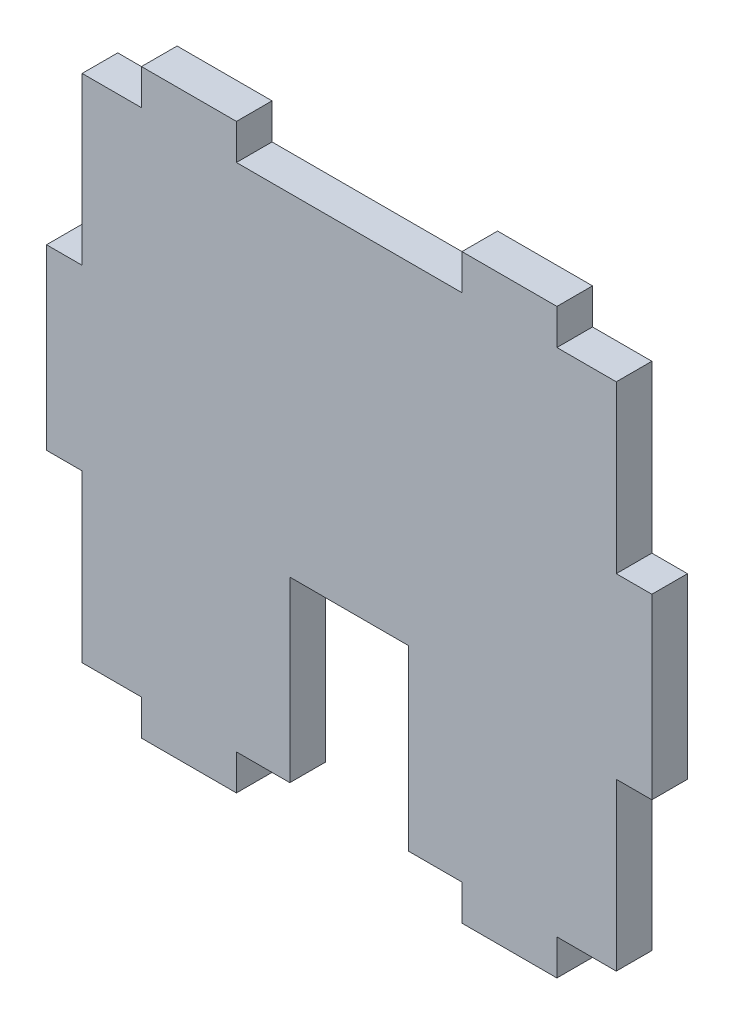
ISO-10303-21;
HEADER;
FILE_DESCRIPTION(('STEP AP214'),'2;1');
FILE_NAME('part.step','',(''),(''),'','','');
FILE_SCHEMA(('AUTOMOTIVE_DESIGN { 1 0 10303 214 1 1 1 1 }'));
ENDSEC;
DATA;
#1=APPLICATION_CONTEXT('core data for automotive mechanical design processes');
#2=APPLICATION_PROTOCOL_DEFINITION('international standard','automotive_design',2000,#1);
#3=PRODUCT_CONTEXT('',#1,'mechanical');
#4=PRODUCT('Part','Part','',(#3));
#5=PRODUCT_RELATED_PRODUCT_CATEGORY('part','',(#4));
#6=PRODUCT_DEFINITION_FORMATION('','',#4);
#7=PRODUCT_DEFINITION_CONTEXT('part definition',#1,'design');
#8=PRODUCT_DEFINITION('design','',#6,#7);
#9=PRODUCT_DEFINITION_SHAPE('','',#8);
#10=(LENGTH_UNIT() NAMED_UNIT(*) SI_UNIT(.MILLI.,.METRE.));
#11=(NAMED_UNIT(*) PLANE_ANGLE_UNIT() SI_UNIT($,.RADIAN.));
#12=(NAMED_UNIT(*) SI_UNIT($,.STERADIAN.) SOLID_ANGLE_UNIT());
#13=UNCERTAINTY_MEASURE_WITH_UNIT(LENGTH_MEASURE(1.E-05),#10,'distance_accuracy_value','');
#14=(GEOMETRIC_REPRESENTATION_CONTEXT(3) GLOBAL_UNCERTAINTY_ASSIGNED_CONTEXT((#13)) GLOBAL_UNIT_ASSIGNED_CONTEXT((#10,
#11,#12)) REPRESENTATION_CONTEXT('',''));
#15=CARTESIAN_POINT('',(0.,0.,0.));
#16=DIRECTION('',(0.,0.,1.));
#17=DIRECTION('',(1.,0.,0.));
#18=AXIS2_PLACEMENT_3D('',#15,#16,#17);
#19=CARTESIAN_POINT('',(0.,-21.5,3.));
#20=DIRECTION('',(0.,1.,0.));
#21=DIRECTION('',(0.,0.,1.));
#22=AXIS2_PLACEMENT_3D('',#19,#20,#21);
#23=PLANE('',#22);
#24=DIRECTION('',(1.,0.,0.));
#25=VECTOR('',#24,1.);
#26=CARTESIAN_POINT('',(0.,-21.5,3.));
#27=LINE('',#26,#25);
#28=CARTESIAN_POINT('',(5.,-21.5,3.));
#29=VERTEX_POINT('',#28);
#30=CARTESIAN_POINT('',(9.5,-21.5,3.));
#31=VERTEX_POINT('',#30);
#32=EDGE_CURVE('E428',#29,#31,#27,.T.);
#33=ORIENTED_EDGE('',*,*,#32,.F.);
#34=DIRECTION('',(0.,0.,1.));
#35=VECTOR('',#34,1.);
#36=CARTESIAN_POINT('',(5.,-21.5,-7.));
#37=LINE('',#36,#35);
#38=CARTESIAN_POINT('',(5.,-21.5,0.));
#39=VERTEX_POINT('',#38);
#40=EDGE_CURVE('E272',#39,#29,#37,.T.);
#41=ORIENTED_EDGE('',*,*,#40,.F.);
#42=DIRECTION('',(1.,0.,0.));
#43=VECTOR('',#42,1.);
#44=CARTESIAN_POINT('',(0.,-21.5,0.));
#45=LINE('',#44,#43);
#46=CARTESIAN_POINT('',(9.5,-21.5,0.));
#47=VERTEX_POINT('',#46);
#48=EDGE_CURVE('E309',#39,#47,#45,.T.);
#49=ORIENTED_EDGE('',*,*,#48,.T.);
#50=DIRECTION('',(0.,0.,-1.));
#51=VECTOR('',#50,1.);
#52=CARTESIAN_POINT('',(9.5,-21.5,3.));
#53=LINE('',#52,#51);
#54=EDGE_CURVE('E346',#31,#47,#53,.T.);
#55=ORIENTED_EDGE('',*,*,#54,.F.);
#56=EDGE_LOOP('',(#33,#41,#49,#55));
#57=FACE_BOUND('',#56,.T.);
#58=ADVANCED_FACE('F41',(#57),#23,.F.);
#59=CARTESIAN_POINT('',(22.5,0.,3.));
#60=DIRECTION('',(1.,0.,0.));
#61=DIRECTION('',(0.,1.,0.));
#62=AXIS2_PLACEMENT_3D('',#59,#60,#61);
#63=PLANE('',#62);
#64=DIRECTION('',(0.,-1.,0.));
#65=VECTOR('',#64,1.);
#66=CARTESIAN_POINT('',(22.5,0.,0.));
#67=LINE('',#66,#65);
#68=CARTESIAN_POINT('',(22.5,21.5,0.));
#69=VERTEX_POINT('',#68);
#70=CARTESIAN_POINT('',(22.5,7.5,0.));
#71=VERTEX_POINT('',#70);
#72=EDGE_CURVE('E269',#69,#71,#67,.T.);
#73=ORIENTED_EDGE('',*,*,#72,.F.);
#74=DIRECTION('',(0.,0.,-1.));
#75=VECTOR('',#74,1.);
#76=CARTESIAN_POINT('',(22.5,21.5,3.));
#77=LINE('',#76,#75);
#78=CARTESIAN_POINT('',(22.5,21.5,3.));
#79=VERTEX_POINT('',#78);
#80=EDGE_CURVE('E161',#79,#69,#77,.T.);
#81=ORIENTED_EDGE('',*,*,#80,.F.);
#82=DIRECTION('',(0.,-1.,0.));
#83=VECTOR('',#82,1.);
#84=CARTESIAN_POINT('',(22.5,0.,3.));
#85=LINE('',#84,#83);
#86=CARTESIAN_POINT('',(22.5,7.5,3.));
#87=VERTEX_POINT('',#86);
#88=EDGE_CURVE('E334',#79,#87,#85,.T.);
#89=ORIENTED_EDGE('',*,*,#88,.T.);
#90=DIRECTION('',(0.,0.,-1.));
#91=VECTOR('',#90,1.);
#92=CARTESIAN_POINT('',(22.5,7.5,3.));
#93=LINE('',#92,#91);
#94=EDGE_CURVE('E65',#87,#71,#93,.T.);
#95=ORIENTED_EDGE('',*,*,#94,.T.);
#96=EDGE_LOOP('',(#73,#81,#89,#95));
#97=FACE_BOUND('',#96,.T.);
#98=ADVANCED_FACE('F518',(#97),#63,.T.);
#99=CARTESIAN_POINT('',(0.,21.5,3.));
#100=DIRECTION('',(0.,1.,0.));
#101=DIRECTION('',(0.,0.,1.));
#102=AXIS2_PLACEMENT_3D('',#99,#100,#101);
#103=PLANE('',#102);
#104=DIRECTION('',(1.,0.,0.));
#105=VECTOR('',#104,1.);
#106=CARTESIAN_POINT('',(0.,21.5,0.));
#107=LINE('',#106,#105);
#108=CARTESIAN_POINT('',(17.5,21.5,0.));
#109=VERTEX_POINT('',#108);
#110=EDGE_CURVE('E271',#109,#69,#107,.T.);
#111=ORIENTED_EDGE('',*,*,#110,.F.);
#112=DIRECTION('',(0.,0.,-1.));
#113=VECTOR('',#112,1.);
#114=CARTESIAN_POINT('',(17.5,21.5,3.));
#115=LINE('',#114,#113);
#116=CARTESIAN_POINT('',(17.5,21.5,3.));
#117=VERTEX_POINT('',#116);
#118=EDGE_CURVE('E389',#117,#109,#115,.T.);
#119=ORIENTED_EDGE('',*,*,#118,.F.);
#120=DIRECTION('',(1.,0.,0.));
#121=VECTOR('',#120,1.);
#122=CARTESIAN_POINT('',(0.,21.5,3.));
#123=LINE('',#122,#121);
#124=EDGE_CURVE('E473',#117,#79,#123,.T.);
#125=ORIENTED_EDGE('',*,*,#124,.T.);
#126=ORIENTED_EDGE('',*,*,#80,.T.);
#127=EDGE_LOOP('',(#111,#119,#125,#126));
#128=FACE_BOUND('',#127,.T.);
#129=ADVANCED_FACE('F525',(#128),#103,.T.);
#130=CARTESIAN_POINT('',(17.5,0.,3.));
#131=DIRECTION('',(-1.,0.,0.));
#132=DIRECTION('',(0.,-1.,0.));
#133=AXIS2_PLACEMENT_3D('',#130,#131,#132);
#134=PLANE('',#133);
#135=DIRECTION('',(0.,1.,0.));
#136=VECTOR('',#135,1.);
#137=CARTESIAN_POINT('',(17.5,0.,0.));
#138=LINE('',#137,#136);
#139=CARTESIAN_POINT('',(17.5,24.5,0.));
#140=VERTEX_POINT('',#139);
#141=EDGE_CURVE('E276',#109,#140,#138,.T.);
#142=ORIENTED_EDGE('',*,*,#141,.T.);
#143=DIRECTION('',(0.,0.,-1.));
#144=VECTOR('',#143,1.);
#145=CARTESIAN_POINT('',(17.5,24.5,3.));
#146=LINE('',#145,#144);
#147=CARTESIAN_POINT('',(17.5,24.5,3.));
#148=VERTEX_POINT('',#147);
#149=EDGE_CURVE('E386',#148,#140,#146,.T.);
#150=ORIENTED_EDGE('',*,*,#149,.F.);
#151=DIRECTION('',(0.,1.,0.));
#152=VECTOR('',#151,1.);
#153=CARTESIAN_POINT('',(17.5,0.,3.));
#154=LINE('',#153,#152);
#155=EDGE_CURVE('E471',#117,#148,#154,.T.);
#156=ORIENTED_EDGE('',*,*,#155,.F.);
#157=ORIENTED_EDGE('',*,*,#118,.T.);
#158=EDGE_LOOP('',(#142,#150,#156,#157));
#159=FACE_BOUND('',#158,.T.);
#160=ADVANCED_FACE('F43',(#159),#134,.F.);
#161=CARTESIAN_POINT('',(0.,24.5,3.));
#162=DIRECTION('',(0.,-1.,0.));
#163=DIRECTION('',(1.,0.,0.));
#164=AXIS2_PLACEMENT_3D('',#161,#162,#163);
#165=PLANE('',#164);
#166=DIRECTION('',(-1.,0.,0.));
#167=VECTOR('',#166,1.);
#168=CARTESIAN_POINT('',(0.,24.5,0.));
#169=LINE('',#168,#167);
#170=CARTESIAN_POINT('',(9.5,24.5,0.));
#171=VERTEX_POINT('',#170);
#172=EDGE_CURVE('E280',#140,#171,#169,.T.);
#173=ORIENTED_EDGE('',*,*,#172,.T.);
#174=DIRECTION('',(0.,0.,-1.));
#175=VECTOR('',#174,1.);
#176=CARTESIAN_POINT('',(9.5,24.5,3.));
#177=LINE('',#176,#175);
#178=CARTESIAN_POINT('',(9.5,24.5,3.));
#179=VERTEX_POINT('',#178);
#180=EDGE_CURVE('E384',#179,#171,#177,.T.);
#181=ORIENTED_EDGE('',*,*,#180,.F.);
#182=DIRECTION('',(-1.,0.,0.));
#183=VECTOR('',#182,1.);
#184=CARTESIAN_POINT('',(0.,24.5,3.));
#185=LINE('',#184,#183);
#186=EDGE_CURVE('E469',#148,#179,#185,.T.);
#187=ORIENTED_EDGE('',*,*,#186,.F.);
#188=ORIENTED_EDGE('',*,*,#149,.T.);
#189=EDGE_LOOP('',(#173,#181,#187,#188));
#190=FACE_BOUND('',#189,.T.);
#191=ADVANCED_FACE('F596',(#190),#165,.F.);
#192=CARTESIAN_POINT('',(9.5,0.,3.));
#193=DIRECTION('',(-1.,0.,0.));
#194=DIRECTION('',(0.,0.,1.));
#195=AXIS2_PLACEMENT_3D('',#192,#193,#194);
#196=PLANE('',#195);
#197=DIRECTION('',(0.,1.,0.));
#198=VECTOR('',#197,1.);
#199=CARTESIAN_POINT('',(9.5,0.,0.));
#200=LINE('',#199,#198);
#201=CARTESIAN_POINT('',(9.5,21.5,0.));
#202=VERTEX_POINT('',#201);
#203=EDGE_CURVE('E283',#202,#171,#200,.T.);
#204=ORIENTED_EDGE('',*,*,#203,.F.);
#205=DIRECTION('',(0.,0.,-1.));
#206=VECTOR('',#205,1.);
#207=CARTESIAN_POINT('',(9.5,21.5,3.));
#208=LINE('',#207,#206);
#209=CARTESIAN_POINT('',(9.5,21.5,3.));
#210=VERTEX_POINT('',#209);
#211=EDGE_CURVE('E382',#210,#202,#208,.T.);
#212=ORIENTED_EDGE('',*,*,#211,.F.);
#213=DIRECTION('',(0.,1.,0.));
#214=VECTOR('',#213,1.);
#215=CARTESIAN_POINT('',(9.5,0.,3.));
#216=LINE('',#215,#214);
#217=EDGE_CURVE('E466',#210,#179,#216,.T.);
#218=ORIENTED_EDGE('',*,*,#217,.T.);
#219=ORIENTED_EDGE('',*,*,#180,.T.);
#220=EDGE_LOOP('',(#204,#212,#218,#219));
#221=FACE_BOUND('',#220,.T.);
#222=ADVANCED_FACE('F594',(#221),#196,.T.);
#223=CARTESIAN_POINT('',(-9.5,21.5,0.));
#224=VERTEX_POINT('',#223);
#225=EDGE_CURVE('E278',#224,#202,#107,.T.);
#226=ORIENTED_EDGE('',*,*,#225,.F.);
#227=DIRECTION('',(0.,0.,-1.));
#228=VECTOR('',#227,1.);
#229=CARTESIAN_POINT('',(-9.5,21.5,3.));
#230=LINE('',#229,#228);
#231=CARTESIAN_POINT('',(-9.5,21.5,3.));
#232=VERTEX_POINT('',#231);
#233=EDGE_CURVE('E380',#232,#224,#230,.T.);
#234=ORIENTED_EDGE('',*,*,#233,.F.);
#235=EDGE_CURVE('E465',#232,#210,#123,.T.);
#236=ORIENTED_EDGE('',*,*,#235,.T.);
#237=ORIENTED_EDGE('',*,*,#211,.T.);
#238=EDGE_LOOP('',(#226,#234,#236,#237));
#239=FACE_BOUND('',#238,.T.);
#240=ADVANCED_FACE('F582',(#239),#103,.T.);
#241=CARTESIAN_POINT('',(-9.5,0.,3.));
#242=DIRECTION('',(-1.,0.,0.));
#243=DIRECTION('',(0.,0.,1.));
#244=AXIS2_PLACEMENT_3D('',#241,#242,#243);
#245=PLANE('',#244);
#246=DIRECTION('',(0.,1.,0.));
#247=VECTOR('',#246,1.);
#248=CARTESIAN_POINT('',(-9.5,0.,0.));
#249=LINE('',#248,#247);
#250=CARTESIAN_POINT('',(-9.5,24.5,0.));
#251=VERTEX_POINT('',#250);
#252=EDGE_CURVE('E286',#224,#251,#249,.T.);
#253=ORIENTED_EDGE('',*,*,#252,.T.);
#254=DIRECTION('',(0.,0.,-1.));
#255=VECTOR('',#254,1.);
#256=CARTESIAN_POINT('',(-9.5,24.5,3.));
#257=LINE('',#256,#255);
#258=CARTESIAN_POINT('',(-9.5,24.5,3.));
#259=VERTEX_POINT('',#258);
#260=EDGE_CURVE('E378',#259,#251,#257,.T.);
#261=ORIENTED_EDGE('',*,*,#260,.F.);
#262=DIRECTION('',(0.,1.,0.));
#263=VECTOR('',#262,1.);
#264=CARTESIAN_POINT('',(-9.5,0.,3.));
#265=LINE('',#264,#263);
#266=EDGE_CURVE('E463',#232,#259,#265,.T.);
#267=ORIENTED_EDGE('',*,*,#266,.F.);
#268=ORIENTED_EDGE('',*,*,#233,.T.);
#269=EDGE_LOOP('',(#253,#261,#267,#268));
#270=FACE_BOUND('',#269,.T.);
#271=ADVANCED_FACE('F589',(#270),#245,.F.);
#272=CARTESIAN_POINT('',(0.,24.5,3.));
#273=DIRECTION('',(0.,1.,0.));
#274=DIRECTION('',(-1.,0.,0.));
#275=AXIS2_PLACEMENT_3D('',#272,#273,#274);
#276=PLANE('',#275);
#277=DIRECTION('',(1.,0.,0.));
#278=VECTOR('',#277,1.);
#279=CARTESIAN_POINT('',(0.,24.5,0.));
#280=LINE('',#279,#278);
#281=CARTESIAN_POINT('',(-17.5,24.5,0.));
#282=VERTEX_POINT('',#281);
#283=EDGE_CURVE('E289',#282,#251,#280,.T.);
#284=ORIENTED_EDGE('',*,*,#283,.F.);
#285=DIRECTION('',(0.,0.,-1.));
#286=VECTOR('',#285,1.);
#287=CARTESIAN_POINT('',(-17.5,24.5,3.));
#288=LINE('',#287,#286);
#289=CARTESIAN_POINT('',(-17.5,24.5,3.));
#290=VERTEX_POINT('',#289);
#291=EDGE_CURVE('E376',#290,#282,#288,.T.);
#292=ORIENTED_EDGE('',*,*,#291,.F.);
#293=DIRECTION('',(1.,0.,0.));
#294=VECTOR('',#293,1.);
#295=CARTESIAN_POINT('',(0.,24.5,3.));
#296=LINE('',#295,#294);
#297=EDGE_CURVE('E460',#290,#259,#296,.T.);
#298=ORIENTED_EDGE('',*,*,#297,.T.);
#299=ORIENTED_EDGE('',*,*,#260,.T.);
#300=EDGE_LOOP('',(#284,#292,#298,#299));
#301=FACE_BOUND('',#300,.T.);
#302=ADVANCED_FACE('F585',(#301),#276,.T.);
#303=CARTESIAN_POINT('',(-17.5,0.,3.));
#304=DIRECTION('',(-1.,0.,0.));
#305=DIRECTION('',(0.,0.,1.));
#306=AXIS2_PLACEMENT_3D('',#303,#304,#305);
#307=PLANE('',#306);
#308=DIRECTION('',(0.,1.,0.));
#309=VECTOR('',#308,1.);
#310=CARTESIAN_POINT('',(-17.5,0.,0.));
#311=LINE('',#310,#309);
#312=CARTESIAN_POINT('',(-17.5,21.5,0.));
#313=VERTEX_POINT('',#312);
#314=EDGE_CURVE('E292',#313,#282,#311,.T.);
#315=ORIENTED_EDGE('',*,*,#314,.F.);
#316=DIRECTION('',(0.,0.,-1.));
#317=VECTOR('',#316,1.);
#318=CARTESIAN_POINT('',(-17.5,21.5,3.));
#319=LINE('',#318,#317);
#320=CARTESIAN_POINT('',(-17.5,21.5,3.));
#321=VERTEX_POINT('',#320);
#322=EDGE_CURVE('E374',#321,#313,#319,.T.);
#323=ORIENTED_EDGE('',*,*,#322,.F.);
#324=DIRECTION('',(0.,1.,0.));
#325=VECTOR('',#324,1.);
#326=CARTESIAN_POINT('',(-17.5,0.,3.));
#327=LINE('',#326,#325);
#328=EDGE_CURVE('E457',#321,#290,#327,.T.);
#329=ORIENTED_EDGE('',*,*,#328,.T.);
#330=ORIENTED_EDGE('',*,*,#291,.T.);
#331=EDGE_LOOP('',(#315,#323,#329,#330));
#332=FACE_BOUND('',#331,.T.);
#333=ADVANCED_FACE('F580',(#332),#307,.T.);
#334=CARTESIAN_POINT('',(-22.5,21.5,0.));
#335=VERTEX_POINT('',#334);
#336=EDGE_CURVE('E277',#335,#313,#107,.T.);
#337=ORIENTED_EDGE('',*,*,#336,.F.);
#338=DIRECTION('',(0.,0.,-1.));
#339=VECTOR('',#338,1.);
#340=CARTESIAN_POINT('',(-22.5,21.5,3.));
#341=LINE('',#340,#339);
#342=CARTESIAN_POINT('',(-22.5,21.5,3.));
#343=VERTEX_POINT('',#342);
#344=EDGE_CURVE('E372',#343,#335,#341,.T.);
#345=ORIENTED_EDGE('',*,*,#344,.F.);
#346=EDGE_CURVE('E456',#343,#321,#123,.T.);
#347=ORIENTED_EDGE('',*,*,#346,.T.);
#348=ORIENTED_EDGE('',*,*,#322,.T.);
#349=EDGE_LOOP('',(#337,#345,#347,#348));
#350=FACE_BOUND('',#349,.T.);
#351=ADVANCED_FACE('F577',(#350),#103,.T.);
#352=CARTESIAN_POINT('',(-22.5,0.,3.));
#353=DIRECTION('',(1.,0.,0.));
#354=DIRECTION('',(0.,1.,0.));
#355=AXIS2_PLACEMENT_3D('',#352,#353,#354);
#356=PLANE('',#355);
#357=DIRECTION('',(0.,-1.,0.));
#358=VECTOR('',#357,1.);
#359=CARTESIAN_POINT('',(-22.5,0.,0.));
#360=LINE('',#359,#358);
#361=CARTESIAN_POINT('',(-22.5,7.5,0.));
#362=VERTEX_POINT('',#361);
#363=EDGE_CURVE('E295',#335,#362,#360,.T.);
#364=ORIENTED_EDGE('',*,*,#363,.T.);
#365=DIRECTION('',(0.,0.,-1.));
#366=VECTOR('',#365,1.);
#367=CARTESIAN_POINT('',(-22.5,7.5,3.));
#368=LINE('',#367,#366);
#369=CARTESIAN_POINT('',(-22.5,7.5,3.));
#370=VERTEX_POINT('',#369);
#371=EDGE_CURVE('E369',#370,#362,#368,.T.);
#372=ORIENTED_EDGE('',*,*,#371,.F.);
#373=DIRECTION('',(0.,-1.,0.));
#374=VECTOR('',#373,1.);
#375=CARTESIAN_POINT('',(-22.5,0.,3.));
#376=LINE('',#375,#374);
#377=EDGE_CURVE('E454',#343,#370,#376,.T.);
#378=ORIENTED_EDGE('',*,*,#377,.F.);
#379=ORIENTED_EDGE('',*,*,#344,.T.);
#380=EDGE_LOOP('',(#364,#372,#378,#379));
#381=FACE_BOUND('',#380,.T.);
#382=ADVANCED_FACE('F565',(#381),#356,.F.);
#383=CARTESIAN_POINT('',(0.,7.50000000000002,3.));
#384=DIRECTION('',(0.,-1.,0.));
#385=DIRECTION('',(1.,0.,0.));
#386=AXIS2_PLACEMENT_3D('',#383,#384,#385);
#387=PLANE('',#386);
#388=DIRECTION('',(-1.,0.,0.));
#389=VECTOR('',#388,1.);
#390=CARTESIAN_POINT('',(0.,7.50000000000002,0.));
#391=LINE('',#390,#389);
#392=CARTESIAN_POINT('',(-25.5,7.5,0.));
#393=VERTEX_POINT('',#392);
#394=EDGE_CURVE('E297',#362,#393,#391,.T.);
#395=ORIENTED_EDGE('',*,*,#394,.T.);
#396=DIRECTION('',(0.,0.,-1.));
#397=VECTOR('',#396,1.);
#398=CARTESIAN_POINT('',(-25.5,7.5,3.));
#399=LINE('',#398,#397);
#400=CARTESIAN_POINT('',(-25.5,7.5,3.));
#401=VERTEX_POINT('',#400);
#402=EDGE_CURVE('E366',#401,#393,#399,.T.);
#403=ORIENTED_EDGE('',*,*,#402,.F.);
#404=DIRECTION('',(-1.,0.,0.));
#405=VECTOR('',#404,1.);
#406=CARTESIAN_POINT('',(0.,7.50000000000002,3.));
#407=LINE('',#406,#405);
#408=EDGE_CURVE('E452',#370,#401,#407,.T.);
#409=ORIENTED_EDGE('',*,*,#408,.F.);
#410=ORIENTED_EDGE('',*,*,#371,.T.);
#411=EDGE_LOOP('',(#395,#403,#409,#410));
#412=FACE_BOUND('',#411,.T.);
#413=ADVANCED_FACE('F572',(#412),#387,.F.);
#414=CARTESIAN_POINT('',(-25.5,0.,3.));
#415=DIRECTION('',(1.,0.,0.));
#416=DIRECTION('',(0.,1.,0.));
#417=AXIS2_PLACEMENT_3D('',#414,#415,#416);
#418=PLANE('',#417);
#419=DIRECTION('',(0.,-1.,0.));
#420=VECTOR('',#419,1.);
#421=CARTESIAN_POINT('',(-25.5,0.,0.));
#422=LINE('',#421,#420);
#423=CARTESIAN_POINT('',(-25.5,-7.5,0.));
#424=VERTEX_POINT('',#423);
#425=EDGE_CURVE('E300',#393,#424,#422,.T.);
#426=ORIENTED_EDGE('',*,*,#425,.T.);
#427=DIRECTION('',(0.,0.,-1.));
#428=VECTOR('',#427,1.);
#429=CARTESIAN_POINT('',(-25.5,-7.5,3.));
#430=LINE('',#429,#428);
#431=CARTESIAN_POINT('',(-25.5,-7.5,3.));
#432=VERTEX_POINT('',#431);
#433=EDGE_CURVE('E364',#432,#424,#430,.T.);
#434=ORIENTED_EDGE('',*,*,#433,.F.);
#435=DIRECTION('',(0.,-1.,0.));
#436=VECTOR('',#435,1.);
#437=CARTESIAN_POINT('',(-25.5,0.,3.));
#438=LINE('',#437,#436);
#439=EDGE_CURVE('E450',#401,#432,#438,.T.);
#440=ORIENTED_EDGE('',*,*,#439,.F.);
#441=ORIENTED_EDGE('',*,*,#402,.T.);
#442=EDGE_LOOP('',(#426,#434,#440,#441));
#443=FACE_BOUND('',#442,.T.);
#444=ADVANCED_FACE('F568',(#443),#418,.F.);
#445=CARTESIAN_POINT('',(0.,-7.50000000000001,3.));
#446=DIRECTION('',(0.,-1.,0.));
#447=DIRECTION('',(1.,0.,0.));
#448=AXIS2_PLACEMENT_3D('',#445,#446,#447);
#449=PLANE('',#448);
#450=DIRECTION('',(-1.,0.,0.));
#451=VECTOR('',#450,1.);
#452=CARTESIAN_POINT('',(0.,-7.50000000000001,0.));
#453=LINE('',#452,#451);
#454=CARTESIAN_POINT('',(-22.5,-7.5,0.));
#455=VERTEX_POINT('',#454);
#456=EDGE_CURVE('E303',#455,#424,#453,.T.);
#457=ORIENTED_EDGE('',*,*,#456,.F.);
#458=DIRECTION('',(0.,0.,-1.));
#459=VECTOR('',#458,1.);
#460=CARTESIAN_POINT('',(-22.5,-7.5,3.));
#461=LINE('',#460,#459);
#462=CARTESIAN_POINT('',(-22.5,-7.5,3.));
#463=VERTEX_POINT('',#462);
#464=EDGE_CURVE('E362',#463,#455,#461,.T.);
#465=ORIENTED_EDGE('',*,*,#464,.F.);
#466=DIRECTION('',(-1.,0.,0.));
#467=VECTOR('',#466,1.);
#468=CARTESIAN_POINT('',(0.,-7.50000000000001,3.));
#469=LINE('',#468,#467);
#470=EDGE_CURVE('E447',#463,#432,#469,.T.);
#471=ORIENTED_EDGE('',*,*,#470,.T.);
#472=ORIENTED_EDGE('',*,*,#433,.T.);
#473=EDGE_LOOP('',(#457,#465,#471,#472));
#474=FACE_BOUND('',#473,.T.);
#475=ADVANCED_FACE('F563',(#474),#449,.T.);
#476=CARTESIAN_POINT('',(-22.5,-21.5,0.));
#477=VERTEX_POINT('',#476);
#478=EDGE_CURVE('E298',#455,#477,#360,.T.);
#479=ORIENTED_EDGE('',*,*,#478,.T.);
#480=DIRECTION('',(0.,0.,-1.));
#481=VECTOR('',#480,1.);
#482=CARTESIAN_POINT('',(-22.5,-21.5,3.));
#483=LINE('',#482,#481);
#484=CARTESIAN_POINT('',(-22.5,-21.5,3.));
#485=VERTEX_POINT('',#484);
#486=EDGE_CURVE('E359',#485,#477,#483,.T.);
#487=ORIENTED_EDGE('',*,*,#486,.F.);
#488=EDGE_CURVE('E446',#463,#485,#376,.T.);
#489=ORIENTED_EDGE('',*,*,#488,.F.);
#490=ORIENTED_EDGE('',*,*,#464,.T.);
#491=EDGE_LOOP('',(#479,#487,#489,#490));
#492=FACE_BOUND('',#491,.T.);
#493=ADVANCED_FACE('F530',(#492),#356,.F.);
#494=CARTESIAN_POINT('',(-17.5,-21.5,0.));
#495=VERTEX_POINT('',#494);
#496=EDGE_CURVE('E306',#477,#495,#45,.T.);
#497=ORIENTED_EDGE('',*,*,#496,.T.);
#498=DIRECTION('',(0.,0.,-1.));
#499=VECTOR('',#498,1.);
#500=CARTESIAN_POINT('',(-17.5,-21.5,3.));
#501=LINE('',#500,#499);
#502=CARTESIAN_POINT('',(-17.5,-21.5,3.));
#503=VERTEX_POINT('',#502);
#504=EDGE_CURVE('E356',#503,#495,#501,.T.);
#505=ORIENTED_EDGE('',*,*,#504,.F.);
#506=EDGE_CURVE('E444',#485,#503,#27,.T.);
#507=ORIENTED_EDGE('',*,*,#506,.F.);
#508=ORIENTED_EDGE('',*,*,#486,.T.);
#509=EDGE_LOOP('',(#497,#505,#507,#508));
#510=FACE_BOUND('',#509,.T.);
#511=ADVANCED_FACE('F521',(#510),#23,.F.);
#512=CARTESIAN_POINT('',(-17.5,0.,3.));
#513=DIRECTION('',(1.,0.,0.));
#514=DIRECTION('',(0.,0.,-1.));
#515=AXIS2_PLACEMENT_3D('',#512,#513,#514);
#516=PLANE('',#515);
#517=DIRECTION('',(0.,-1.,0.));
#518=VECTOR('',#517,1.);
#519=CARTESIAN_POINT('',(-17.5,0.,0.));
#520=LINE('',#519,#518);
#521=CARTESIAN_POINT('',(-17.5,-24.5,0.));
#522=VERTEX_POINT('',#521);
#523=EDGE_CURVE('E308',#495,#522,#520,.T.);
#524=ORIENTED_EDGE('',*,*,#523,.T.);
#525=DIRECTION('',(0.,0.,-1.));
#526=VECTOR('',#525,1.);
#527=CARTESIAN_POINT('',(-17.5,-24.5,3.));
#528=LINE('',#527,#526);
#529=CARTESIAN_POINT('',(-17.5,-24.5,3.));
#530=VERTEX_POINT('',#529);
#531=EDGE_CURVE('E353',#530,#522,#528,.T.);
#532=ORIENTED_EDGE('',*,*,#531,.F.);
#533=DIRECTION('',(0.,-1.,0.));
#534=VECTOR('',#533,1.);
#535=CARTESIAN_POINT('',(-17.5,0.,3.));
#536=LINE('',#535,#534);
#537=EDGE_CURVE('E443',#503,#530,#536,.T.);
#538=ORIENTED_EDGE('',*,*,#537,.F.);
#539=ORIENTED_EDGE('',*,*,#504,.T.);
#540=EDGE_LOOP('',(#524,#532,#538,#539));
#541=FACE_BOUND('',#540,.T.);
#542=ADVANCED_FACE('F529',(#541),#516,.F.);
#543=CARTESIAN_POINT('',(0.,-24.5,3.));
#544=DIRECTION('',(0.,1.,0.));
#545=DIRECTION('',(-1.,0.,0.));
#546=AXIS2_PLACEMENT_3D('',#543,#544,#545);
#547=PLANE('',#546);
#548=DIRECTION('',(1.,0.,0.));
#549=VECTOR('',#548,1.);
#550=CARTESIAN_POINT('',(0.,-24.5,0.));
#551=LINE('',#550,#549);
#552=CARTESIAN_POINT('',(-9.5,-24.5,0.));
#553=VERTEX_POINT('',#552);
#554=EDGE_CURVE('E312',#522,#553,#551,.T.);
#555=ORIENTED_EDGE('',*,*,#554,.T.);
#556=DIRECTION('',(0.,0.,-1.));
#557=VECTOR('',#556,1.);
#558=CARTESIAN_POINT('',(-9.5,-24.5,3.));
#559=LINE('',#558,#557);
#560=CARTESIAN_POINT('',(-9.5,-24.5,3.));
#561=VERTEX_POINT('',#560);
#562=EDGE_CURVE('E351',#561,#553,#559,.T.);
#563=ORIENTED_EDGE('',*,*,#562,.F.);
#564=DIRECTION('',(1.,0.,0.));
#565=VECTOR('',#564,1.);
#566=CARTESIAN_POINT('',(0.,-24.5,3.));
#567=LINE('',#566,#565);
#568=EDGE_CURVE('E441',#530,#561,#567,.T.);
#569=ORIENTED_EDGE('',*,*,#568,.F.);
#570=ORIENTED_EDGE('',*,*,#531,.T.);
#571=EDGE_LOOP('',(#555,#563,#569,#570));
#572=FACE_BOUND('',#571,.T.);
#573=ADVANCED_FACE('F548',(#572),#547,.F.);
#574=CARTESIAN_POINT('',(-9.5,0.,3.));
#575=DIRECTION('',(1.,0.,0.));
#576=DIRECTION('',(0.,0.,-1.));
#577=AXIS2_PLACEMENT_3D('',#574,#575,#576);
#578=PLANE('',#577);
#579=DIRECTION('',(0.,-1.,0.));
#580=VECTOR('',#579,1.);
#581=CARTESIAN_POINT('',(-9.5,0.,0.));
#582=LINE('',#581,#580);
#583=CARTESIAN_POINT('',(-9.5,-21.5,0.));
#584=VERTEX_POINT('',#583);
#585=EDGE_CURVE('E315',#584,#553,#582,.T.);
#586=ORIENTED_EDGE('',*,*,#585,.F.);
#587=DIRECTION('',(0.,0.,-1.));
#588=VECTOR('',#587,1.);
#589=CARTESIAN_POINT('',(-9.5,-21.5,3.));
#590=LINE('',#589,#588);
#591=CARTESIAN_POINT('',(-9.5,-21.5,3.));
#592=VERTEX_POINT('',#591);
#593=EDGE_CURVE('E349',#592,#584,#590,.T.);
#594=ORIENTED_EDGE('',*,*,#593,.F.);
#595=DIRECTION('',(0.,-1.,0.));
#596=VECTOR('',#595,1.);
#597=CARTESIAN_POINT('',(-9.5,0.,3.));
#598=LINE('',#597,#596);
#599=EDGE_CURVE('E438',#592,#561,#598,.T.);
#600=ORIENTED_EDGE('',*,*,#599,.T.);
#601=ORIENTED_EDGE('',*,*,#562,.T.);
#602=EDGE_LOOP('',(#586,#594,#600,#601));
#603=FACE_BOUND('',#602,.T.);
#604=ADVANCED_FACE('F541',(#603),#578,.T.);
#605=CARTESIAN_POINT('',(-5.,-21.5,0.));
#606=VERTEX_POINT('',#605);
#607=EDGE_CURVE('E310',#584,#606,#45,.T.);
#608=ORIENTED_EDGE('',*,*,#607,.T.);
#609=DIRECTION('',(0.,0.,1.));
#610=VECTOR('',#609,1.);
#611=CARTESIAN_POINT('',(-5.,-21.5,-7.));
#612=LINE('',#611,#610);
#613=CARTESIAN_POINT('',(-5.,-21.5,3.));
#614=VERTEX_POINT('',#613);
#615=EDGE_CURVE('E410',#606,#614,#612,.T.);
#616=ORIENTED_EDGE('',*,*,#615,.T.);
#617=EDGE_CURVE('E427',#592,#614,#27,.T.);
#618=ORIENTED_EDGE('',*,*,#617,.F.);
#619=ORIENTED_EDGE('',*,*,#593,.T.);
#620=EDGE_LOOP('',(#608,#616,#618,#619));
#621=FACE_BOUND('',#620,.T.);
#622=ADVANCED_FACE('F407',(#621),#23,.F.);
#623=CARTESIAN_POINT('',(9.5,0.,3.));
#624=DIRECTION('',(1.,0.,0.));
#625=DIRECTION('',(0.,0.,-1.));
#626=AXIS2_PLACEMENT_3D('',#623,#624,#625);
#627=PLANE('',#626);
#628=DIRECTION('',(0.,-1.,0.));
#629=VECTOR('',#628,1.);
#630=CARTESIAN_POINT('',(9.5,0.,0.));
#631=LINE('',#630,#629);
#632=CARTESIAN_POINT('',(9.5,-24.5,0.));
#633=VERTEX_POINT('',#632);
#634=EDGE_CURVE('E318',#47,#633,#631,.T.);
#635=ORIENTED_EDGE('',*,*,#634,.T.);
#636=DIRECTION('',(0.,0.,-1.));
#637=VECTOR('',#636,1.);
#638=CARTESIAN_POINT('',(9.5,-24.5,3.));
#639=LINE('',#638,#637);
#640=CARTESIAN_POINT('',(9.5,-24.5,3.));
#641=VERTEX_POINT('',#640);
#642=EDGE_CURVE('E344',#641,#633,#639,.T.);
#643=ORIENTED_EDGE('',*,*,#642,.F.);
#644=DIRECTION('',(0.,-1.,0.));
#645=VECTOR('',#644,1.);
#646=CARTESIAN_POINT('',(9.5,0.,3.));
#647=LINE('',#646,#645);
#648=EDGE_CURVE('E434',#31,#641,#647,.T.);
#649=ORIENTED_EDGE('',*,*,#648,.F.);
#650=ORIENTED_EDGE('',*,*,#54,.T.);
#651=EDGE_LOOP('',(#635,#643,#649,#650));
#652=FACE_BOUND('',#651,.T.);
#653=ADVANCED_FACE('F540',(#652),#627,.F.);
#654=CARTESIAN_POINT('',(0.,-24.5,3.));
#655=DIRECTION('',(0.,-1.,0.));
#656=DIRECTION('',(1.,0.,0.));
#657=AXIS2_PLACEMENT_3D('',#654,#655,#656);
#658=PLANE('',#657);
#659=DIRECTION('',(-1.,0.,0.));
#660=VECTOR('',#659,1.);
#661=CARTESIAN_POINT('',(0.,-24.5,0.));
#662=LINE('',#661,#660);
#663=CARTESIAN_POINT('',(17.5,-24.5,0.));
#664=VERTEX_POINT('',#663);
#665=EDGE_CURVE('E321',#664,#633,#662,.T.);
#666=ORIENTED_EDGE('',*,*,#665,.F.);
#667=DIRECTION('',(0.,0.,-1.));
#668=VECTOR('',#667,1.);
#669=CARTESIAN_POINT('',(17.5,-24.5,3.));
#670=LINE('',#669,#668);
#671=CARTESIAN_POINT('',(17.5,-24.5,3.));
#672=VERTEX_POINT('',#671);
#673=EDGE_CURVE('E342',#672,#664,#670,.T.);
#674=ORIENTED_EDGE('',*,*,#673,.F.);
#675=DIRECTION('',(-1.,0.,0.));
#676=VECTOR('',#675,1.);
#677=CARTESIAN_POINT('',(0.,-24.5,3.));
#678=LINE('',#677,#676);
#679=EDGE_CURVE('E432',#672,#641,#678,.T.);
#680=ORIENTED_EDGE('',*,*,#679,.T.);
#681=ORIENTED_EDGE('',*,*,#642,.T.);
#682=EDGE_LOOP('',(#666,#674,#680,#681));
#683=FACE_BOUND('',#682,.T.);
#684=ADVANCED_FACE('F538',(#683),#658,.T.);
#685=CARTESIAN_POINT('',(17.5,0.,3.));
#686=DIRECTION('',(1.,0.,0.));
#687=DIRECTION('',(0.,1.,0.));
#688=AXIS2_PLACEMENT_3D('',#685,#686,#687);
#689=PLANE('',#688);
#690=DIRECTION('',(0.,-1.,0.));
#691=VECTOR('',#690,1.);
#692=CARTESIAN_POINT('',(17.5,0.,0.));
#693=LINE('',#692,#691);
#694=CARTESIAN_POINT('',(17.5,-21.5,0.));
#695=VERTEX_POINT('',#694);
#696=EDGE_CURVE('E324',#695,#664,#693,.T.);
#697=ORIENTED_EDGE('',*,*,#696,.F.);
#698=DIRECTION('',(0.,0.,-1.));
#699=VECTOR('',#698,1.);
#700=CARTESIAN_POINT('',(17.5,-21.5,3.));
#701=LINE('',#700,#699);
#702=CARTESIAN_POINT('',(17.5,-21.5,3.));
#703=VERTEX_POINT('',#702);
#704=EDGE_CURVE('E340',#703,#695,#701,.T.);
#705=ORIENTED_EDGE('',*,*,#704,.F.);
#706=DIRECTION('',(0.,-1.,0.));
#707=VECTOR('',#706,1.);
#708=CARTESIAN_POINT('',(17.5,0.,3.));
#709=LINE('',#708,#707);
#710=EDGE_CURVE('E425',#703,#672,#709,.T.);
#711=ORIENTED_EDGE('',*,*,#710,.T.);
#712=ORIENTED_EDGE('',*,*,#673,.T.);
#713=EDGE_LOOP('',(#697,#705,#711,#712));
#714=FACE_BOUND('',#713,.T.);
#715=ADVANCED_FACE('F533',(#714),#689,.T.);
#716=CARTESIAN_POINT('',(22.5,-21.5,0.));
#717=VERTEX_POINT('',#716);
#718=EDGE_CURVE('E327',#695,#717,#45,.T.);
#719=ORIENTED_EDGE('',*,*,#718,.T.);
#720=DIRECTION('',(0.,0.,-1.));
#721=VECTOR('',#720,1.);
#722=CARTESIAN_POINT('',(22.5,-21.5,3.));
#723=LINE('',#722,#721);
#724=CARTESIAN_POINT('',(22.5,-21.5,3.));
#725=VERTEX_POINT('',#724);
#726=EDGE_CURVE('E338',#725,#717,#723,.T.);
#727=ORIENTED_EDGE('',*,*,#726,.F.);
#728=EDGE_CURVE('E423',#703,#725,#27,.T.);
#729=ORIENTED_EDGE('',*,*,#728,.F.);
#730=ORIENTED_EDGE('',*,*,#704,.T.);
#731=EDGE_LOOP('',(#719,#727,#729,#730));
#732=FACE_BOUND('',#731,.T.);
#733=ADVANCED_FACE('F422',(#732),#23,.F.);
#734=CARTESIAN_POINT('',(22.5,-7.5,0.));
#735=VERTEX_POINT('',#734);
#736=EDGE_CURVE('E273',#735,#717,#67,.T.);
#737=ORIENTED_EDGE('',*,*,#736,.F.);
#738=DIRECTION('',(0.,0.,-1.));
#739=VECTOR('',#738,1.);
#740=CARTESIAN_POINT('',(22.5,-7.5,3.));
#741=LINE('',#740,#739);
#742=CARTESIAN_POINT('',(22.5,-7.5,3.));
#743=VERTEX_POINT('',#742);
#744=EDGE_CURVE('E260',#743,#735,#741,.T.);
#745=ORIENTED_EDGE('',*,*,#744,.F.);
#746=EDGE_CURVE('E249',#743,#725,#85,.T.);
#747=ORIENTED_EDGE('',*,*,#746,.T.);
#748=ORIENTED_EDGE('',*,*,#726,.T.);
#749=EDGE_LOOP('',(#737,#745,#747,#748));
#750=FACE_BOUND('',#749,.T.);
#751=ADVANCED_FACE('F420',(#750),#63,.T.);
#752=CARTESIAN_POINT('',(0.,-7.50000000000001,3.));
#753=DIRECTION('',(0.,1.,0.));
#754=DIRECTION('',(-1.,0.,0.));
#755=AXIS2_PLACEMENT_3D('',#752,#753,#754);
#756=PLANE('',#755);
#757=DIRECTION('',(1.,0.,0.));
#758=VECTOR('',#757,1.);
#759=CARTESIAN_POINT('',(0.,-7.50000000000001,0.));
#760=LINE('',#759,#758);
#761=CARTESIAN_POINT('',(25.5,-7.5,0.));
#762=VERTEX_POINT('',#761);
#763=EDGE_CURVE('E256',#735,#762,#760,.T.);
#764=ORIENTED_EDGE('',*,*,#763,.T.);
#765=DIRECTION('',(0.,0.,-1.));
#766=VECTOR('',#765,1.);
#767=CARTESIAN_POINT('',(25.5,-7.5,3.));
#768=LINE('',#767,#766);
#769=CARTESIAN_POINT('',(25.5,-7.5,3.));
#770=VERTEX_POINT('',#769);
#771=EDGE_CURVE('E253',#770,#762,#768,.T.);
#772=ORIENTED_EDGE('',*,*,#771,.F.);
#773=DIRECTION('',(1.,0.,0.));
#774=VECTOR('',#773,1.);
#775=CARTESIAN_POINT('',(0.,-7.50000000000001,3.));
#776=LINE('',#775,#774);
#777=EDGE_CURVE('E241',#743,#770,#776,.T.);
#778=ORIENTED_EDGE('',*,*,#777,.F.);
#779=ORIENTED_EDGE('',*,*,#744,.T.);
#780=EDGE_LOOP('',(#764,#772,#778,#779));
#781=FACE_BOUND('',#780,.T.);
#782=ADVANCED_FACE('F254',(#781),#756,.F.);
#783=CARTESIAN_POINT('',(25.5,0.,3.));
#784=DIRECTION('',(1.,0.,0.));
#785=DIRECTION('',(0.,1.,0.));
#786=AXIS2_PLACEMENT_3D('',#783,#784,#785);
#787=PLANE('',#786);
#788=DIRECTION('',(0.,-1.,0.));
#789=VECTOR('',#788,1.);
#790=CARTESIAN_POINT('',(25.5,0.,0.));
#791=LINE('',#790,#789);
#792=CARTESIAN_POINT('',(25.5,7.5,0.));
#793=VERTEX_POINT('',#792);
#794=EDGE_CURVE('E329',#793,#762,#791,.T.);
#795=ORIENTED_EDGE('',*,*,#794,.F.);
#796=DIRECTION('',(0.,0.,-1.));
#797=VECTOR('',#796,1.);
#798=CARTESIAN_POINT('',(25.5,7.5,3.));
#799=LINE('',#798,#797);
#800=CARTESIAN_POINT('',(25.5,7.5,3.));
#801=VERTEX_POINT('',#800);
#802=EDGE_CURVE('E261',#801,#793,#799,.T.);
#803=ORIENTED_EDGE('',*,*,#802,.F.);
#804=DIRECTION('',(0.,-1.,0.));
#805=VECTOR('',#804,1.);
#806=CARTESIAN_POINT('',(25.5,0.,3.));
#807=LINE('',#806,#805);
#808=EDGE_CURVE('E247',#801,#770,#807,.T.);
#809=ORIENTED_EDGE('',*,*,#808,.T.);
#810=ORIENTED_EDGE('',*,*,#771,.T.);
#811=EDGE_LOOP('',(#795,#803,#809,#810));
#812=FACE_BOUND('',#811,.T.);
#813=ADVANCED_FACE('F263',(#812),#787,.T.);
#814=CARTESIAN_POINT('',(0.,7.50000000000002,3.));
#815=DIRECTION('',(0.,1.,0.));
#816=DIRECTION('',(-1.,0.,0.));
#817=AXIS2_PLACEMENT_3D('',#814,#815,#816);
#818=PLANE('',#817);
#819=DIRECTION('',(1.,0.,0.));
#820=VECTOR('',#819,1.);
#821=CARTESIAN_POINT('',(0.,7.50000000000002,0.));
#822=LINE('',#821,#820);
#823=EDGE_CURVE('E331',#71,#793,#822,.T.);
#824=ORIENTED_EDGE('',*,*,#823,.F.);
#825=ORIENTED_EDGE('',*,*,#94,.F.);
#826=DIRECTION('',(1.,0.,0.));
#827=VECTOR('',#826,1.);
#828=CARTESIAN_POINT('',(0.,7.50000000000002,3.));
#829=LINE('',#828,#827);
#830=EDGE_CURVE('E264',#87,#801,#829,.T.);
#831=ORIENTED_EDGE('',*,*,#830,.T.);
#832=ORIENTED_EDGE('',*,*,#802,.T.);
#833=EDGE_LOOP('',(#824,#825,#831,#832));
#834=FACE_BOUND('',#833,.T.);
#835=ADVANCED_FACE('F698',(#834),#818,.T.);
#836=CARTESIAN_POINT('',(0.,0.,3.));
#837=DIRECTION('',(0.,0.,1.));
#838=DIRECTION('',(1.,0.,0.));
#839=AXIS2_PLACEMENT_3D('',#836,#837,#838);
#840=PLANE('',#839);
#841=DIRECTION('',(0.,1.,0.));
#842=VECTOR('',#841,1.);
#843=CARTESIAN_POINT('',(5.,-6.5,3.));
#844=LINE('',#843,#842);
#845=CARTESIAN_POINT('',(5.,-6.5,3.));
#846=VERTEX_POINT('',#845);
#847=EDGE_CURVE('E489',#29,#846,#844,.T.);
#848=ORIENTED_EDGE('',*,*,#847,.F.);
#849=ORIENTED_EDGE('',*,*,#32,.T.);
#850=ORIENTED_EDGE('',*,*,#648,.T.);
#851=ORIENTED_EDGE('',*,*,#679,.F.);
#852=ORIENTED_EDGE('',*,*,#710,.F.);
#853=ORIENTED_EDGE('',*,*,#728,.T.);
#854=ORIENTED_EDGE('',*,*,#746,.F.);
#855=ORIENTED_EDGE('',*,*,#777,.T.);
#856=ORIENTED_EDGE('',*,*,#808,.F.);
#857=ORIENTED_EDGE('',*,*,#830,.F.);
#858=ORIENTED_EDGE('',*,*,#88,.F.);
#859=ORIENTED_EDGE('',*,*,#124,.F.);
#860=ORIENTED_EDGE('',*,*,#155,.T.);
#861=ORIENTED_EDGE('',*,*,#186,.T.);
#862=ORIENTED_EDGE('',*,*,#217,.F.);
#863=ORIENTED_EDGE('',*,*,#235,.F.);
#864=ORIENTED_EDGE('',*,*,#266,.T.);
#865=ORIENTED_EDGE('',*,*,#297,.F.);
#866=ORIENTED_EDGE('',*,*,#328,.F.);
#867=ORIENTED_EDGE('',*,*,#346,.F.);
#868=ORIENTED_EDGE('',*,*,#377,.T.);
#869=ORIENTED_EDGE('',*,*,#408,.T.);
#870=ORIENTED_EDGE('',*,*,#439,.T.);
#871=ORIENTED_EDGE('',*,*,#470,.F.);
#872=ORIENTED_EDGE('',*,*,#488,.T.);
#873=ORIENTED_EDGE('',*,*,#506,.T.);
#874=ORIENTED_EDGE('',*,*,#537,.T.);
#875=ORIENTED_EDGE('',*,*,#568,.T.);
#876=ORIENTED_EDGE('',*,*,#599,.F.);
#877=ORIENTED_EDGE('',*,*,#617,.T.);
#878=DIRECTION('',(0.,-1.,0.));
#879=VECTOR('',#878,1.);
#880=CARTESIAN_POINT('',(-5.,-6.5,3.));
#881=LINE('',#880,#879);
#882=CARTESIAN_POINT('',(-5.,-6.5,3.));
#883=VERTEX_POINT('',#882);
#884=EDGE_CURVE('E480',#883,#614,#881,.T.);
#885=ORIENTED_EDGE('',*,*,#884,.F.);
#886=DIRECTION('',(-1.,0.,0.));
#887=VECTOR('',#886,1.);
#888=CARTESIAN_POINT('',(-5.,-6.5,3.));
#889=LINE('',#888,#887);
#890=EDGE_CURVE('E487',#846,#883,#889,.T.);
#891=ORIENTED_EDGE('',*,*,#890,.F.);
#892=EDGE_LOOP('',(#848,#849,#850,#851,#852,#853,#854,#855,#856,#857,#858,#859,#860,#861,#862,
#863,#864,#865,#866,#867,#868,#869,#870,#871,#872,#873,#874,#875,#876,#877,#885,#891));
#893=FACE_BOUND('',#892,.T.);
#894=ADVANCED_FACE('F244',(#893),#840,.T.);
#895=CARTESIAN_POINT('',(0.,0.,0.));
#896=DIRECTION('',(0.,0.,1.));
#897=DIRECTION('',(1.,0.,0.));
#898=AXIS2_PLACEMENT_3D('',#895,#896,#897);
#899=PLANE('',#898);
#900=ORIENTED_EDGE('',*,*,#48,.F.);
#901=DIRECTION('',(0.,1.,0.));
#902=VECTOR('',#901,1.);
#903=CARTESIAN_POINT('',(5.,0.,0.));
#904=LINE('',#903,#902);
#905=CARTESIAN_POINT('',(5.,-6.5,0.));
#906=VERTEX_POINT('',#905);
#907=EDGE_CURVE('E11',#39,#906,#904,.T.);
#908=ORIENTED_EDGE('',*,*,#907,.T.);
#909=DIRECTION('',(-1.,0.,0.));
#910=VECTOR('',#909,1.);
#911=CARTESIAN_POINT('',(0.,-6.5,0.));
#912=LINE('',#911,#910);
#913=CARTESIAN_POINT('',(-5.,-6.5,0.));
#914=VERTEX_POINT('',#913);
#915=EDGE_CURVE('E392',#906,#914,#912,.T.);
#916=ORIENTED_EDGE('',*,*,#915,.T.);
#917=DIRECTION('',(0.,-1.,0.));
#918=VECTOR('',#917,1.);
#919=CARTESIAN_POINT('',(-5.,0.,0.));
#920=LINE('',#919,#918);
#921=EDGE_CURVE('E49',#914,#606,#920,.T.);
#922=ORIENTED_EDGE('',*,*,#921,.T.);
#923=ORIENTED_EDGE('',*,*,#607,.F.);
#924=ORIENTED_EDGE('',*,*,#585,.T.);
#925=ORIENTED_EDGE('',*,*,#554,.F.);
#926=ORIENTED_EDGE('',*,*,#523,.F.);
#927=ORIENTED_EDGE('',*,*,#496,.F.);
#928=ORIENTED_EDGE('',*,*,#478,.F.);
#929=ORIENTED_EDGE('',*,*,#456,.T.);
#930=ORIENTED_EDGE('',*,*,#425,.F.);
#931=ORIENTED_EDGE('',*,*,#394,.F.);
#932=ORIENTED_EDGE('',*,*,#363,.F.);
#933=ORIENTED_EDGE('',*,*,#336,.T.);
#934=ORIENTED_EDGE('',*,*,#314,.T.);
#935=ORIENTED_EDGE('',*,*,#283,.T.);
#936=ORIENTED_EDGE('',*,*,#252,.F.);
#937=ORIENTED_EDGE('',*,*,#225,.T.);
#938=ORIENTED_EDGE('',*,*,#203,.T.);
#939=ORIENTED_EDGE('',*,*,#172,.F.);
#940=ORIENTED_EDGE('',*,*,#141,.F.);
#941=ORIENTED_EDGE('',*,*,#110,.T.);
#942=ORIENTED_EDGE('',*,*,#72,.T.);
#943=ORIENTED_EDGE('',*,*,#823,.T.);
#944=ORIENTED_EDGE('',*,*,#794,.T.);
#945=ORIENTED_EDGE('',*,*,#763,.F.);
#946=ORIENTED_EDGE('',*,*,#736,.T.);
#947=ORIENTED_EDGE('',*,*,#718,.F.);
#948=ORIENTED_EDGE('',*,*,#696,.T.);
#949=ORIENTED_EDGE('',*,*,#665,.T.);
#950=ORIENTED_EDGE('',*,*,#634,.F.);
#951=EDGE_LOOP('',(#900,#908,#916,#922,#923,#924,#925,#926,#927,#928,#929,#930,#931,#932,#933,
#934,#935,#936,#937,#938,#939,#940,#941,#942,#943,#944,#945,#946,#947,#948,#949,#950));
#952=FACE_BOUND('',#951,.T.);
#953=ADVANCED_FACE('F400',(#952),#899,.F.);
#954=CARTESIAN_POINT('',(5.,-6.5,-7.));
#955=DIRECTION('',(1.,0.,0.));
#956=DIRECTION('',(0.,1.,0.));
#957=AXIS2_PLACEMENT_3D('',#954,#955,#956);
#958=PLANE('',#957);
#959=ORIENTED_EDGE('',*,*,#40,.T.);
#960=ORIENTED_EDGE('',*,*,#847,.T.);
#961=DIRECTION('',(0.,0.,1.));
#962=VECTOR('',#961,1.);
#963=CARTESIAN_POINT('',(5.,-6.5,-7.));
#964=LINE('',#963,#962);
#965=EDGE_CURVE('E477',#906,#846,#964,.T.);
#966=ORIENTED_EDGE('',*,*,#965,.F.);
#967=ORIENTED_EDGE('',*,*,#907,.F.);
#968=EDGE_LOOP('',(#959,#960,#966,#967));
#969=FACE_BOUND('',#968,.T.);
#970=ADVANCED_FACE('F495',(#969),#958,.F.);
#971=CARTESIAN_POINT('',(-5.,-6.5,-7.));
#972=DIRECTION('',(-1.,0.,0.));
#973=DIRECTION('',(0.,-1.,0.));
#974=AXIS2_PLACEMENT_3D('',#971,#972,#973);
#975=PLANE('',#974);
#976=DIRECTION('',(0.,0.,1.));
#977=VECTOR('',#976,1.);
#978=CARTESIAN_POINT('',(-5.,-6.5,-7.));
#979=LINE('',#978,#977);
#980=EDGE_CURVE('E56',#914,#883,#979,.T.);
#981=ORIENTED_EDGE('',*,*,#980,.T.);
#982=ORIENTED_EDGE('',*,*,#884,.T.);
#983=ORIENTED_EDGE('',*,*,#615,.F.);
#984=ORIENTED_EDGE('',*,*,#921,.F.);
#985=EDGE_LOOP('',(#981,#982,#983,#984));
#986=FACE_BOUND('',#985,.T.);
#987=ADVANCED_FACE('F508',(#986),#975,.F.);
#988=CARTESIAN_POINT('',(-5.,-6.5,-7.));
#989=DIRECTION('',(0.,1.,0.));
#990=DIRECTION('',(-1.,0.,0.));
#991=AXIS2_PLACEMENT_3D('',#988,#989,#990);
#992=PLANE('',#991);
#993=ORIENTED_EDGE('',*,*,#965,.T.);
#994=ORIENTED_EDGE('',*,*,#890,.T.);
#995=ORIENTED_EDGE('',*,*,#980,.F.);
#996=ORIENTED_EDGE('',*,*,#915,.F.);
#997=EDGE_LOOP('',(#993,#994,#995,#996));
#998=FACE_BOUND('',#997,.T.);
#999=ADVANCED_FACE('F503',(#998),#992,.F.);
#1000=CLOSED_SHELL('',(#58,#98,#129,#160,#191,#222,#240,#271,#302,#333,#351,#382,#413,#444,#475,
#493,#511,#542,#573,#604,#622,#653,#684,#715,#733,#751,#782,#813,#835,#894,#953,#970,#987,#999));
#1001=MANIFOLD_SOLID_BREP('B2',#1000);
#1002=ADVANCED_BREP_SHAPE_REPRESENTATION('',(#18,#1001),#14);
#1003=SHAPE_DEFINITION_REPRESENTATION(#9,#1002);
ENDSEC;
END-ISO-10303-21;
